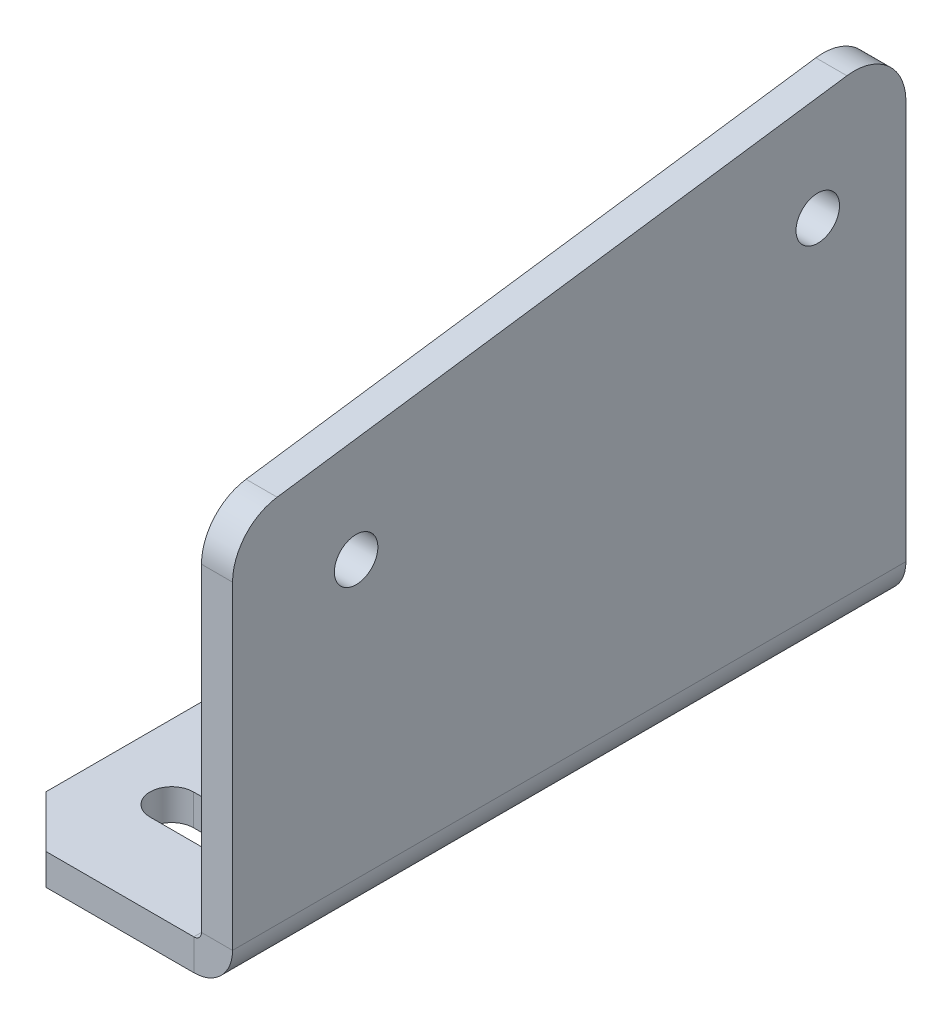
ISO-10303-21;
HEADER;
FILE_DESCRIPTION(('STEP AP214'),'2;1');
FILE_NAME('part.step','',(''),(''),'','','');
FILE_SCHEMA(('AUTOMOTIVE_DESIGN { 1 0 10303 214 1 1 1 1 }'));
ENDSEC;
DATA;
#1=APPLICATION_CONTEXT('core data for automotive mechanical design processes');
#2=APPLICATION_PROTOCOL_DEFINITION('international standard','automotive_design',2000,#1);
#3=PRODUCT_CONTEXT('',#1,'mechanical');
#4=PRODUCT('Part','Part','',(#3));
#5=PRODUCT_RELATED_PRODUCT_CATEGORY('part','',(#4));
#6=PRODUCT_DEFINITION_FORMATION('','',#4);
#7=PRODUCT_DEFINITION_CONTEXT('part definition',#1,'design');
#8=PRODUCT_DEFINITION('design','',#6,#7);
#9=PRODUCT_DEFINITION_SHAPE('','',#8);
#10=(LENGTH_UNIT() NAMED_UNIT(*) SI_UNIT(.MILLI.,.METRE.));
#11=(NAMED_UNIT(*) PLANE_ANGLE_UNIT() SI_UNIT($,.RADIAN.));
#12=(NAMED_UNIT(*) SI_UNIT($,.STERADIAN.) SOLID_ANGLE_UNIT());
#13=UNCERTAINTY_MEASURE_WITH_UNIT(LENGTH_MEASURE(1.E-05),#10,'distance_accuracy_value','');
#14=(GEOMETRIC_REPRESENTATION_CONTEXT(3) GLOBAL_UNCERTAINTY_ASSIGNED_CONTEXT((#13)) GLOBAL_UNIT_ASSIGNED_CONTEXT((#10,
#11,#12)) REPRESENTATION_CONTEXT('',''));
#15=CARTESIAN_POINT('',(0.,0.,0.));
#16=DIRECTION('',(0.,0.,1.));
#17=DIRECTION('',(1.,0.,0.));
#18=AXIS2_PLACEMENT_3D('',#15,#16,#17);
#19=CARTESIAN_POINT('',(0.,0.736599999999999,65.));
#20=DIRECTION('',(0.,0.,1.));
#21=DIRECTION('',(1.,0.,0.));
#22=AXIS2_PLACEMENT_3D('',#19,#20,#21);
#23=PLANE('',#22);
#24=DIRECTION('',(1.,0.,0.));
#25=VECTOR('',#24,1.);
#26=CARTESIAN_POINT('',(0.,0.736599999999999,65.));
#27=LINE('',#26,#25);
#28=CARTESIAN_POINT('',(0.,0.736599999999999,65.));
#29=VERTEX_POINT('',#28);
#30=CARTESIAN_POINT('',(3.,0.736599999999999,65.));
#31=VERTEX_POINT('',#30);
#32=EDGE_CURVE('E317',#29,#31,#27,.T.);
#33=ORIENTED_EDGE('',*,*,#32,.F.);
#34=CARTESIAN_POINT('',(-0.7366,0.7366,65.));
#35=DIRECTION('',(0.,0.,-1.));
#36=DIRECTION('',(-1.,0.,0.));
#37=AXIS2_PLACEMENT_3D('',#34,#35,#36);
#38=CIRCLE('',#37,0.7366);
#39=CARTESIAN_POINT('',(-0.7366,0.,65.));
#40=VERTEX_POINT('',#39);
#41=EDGE_CURVE('E267',#40,#29,#38,.F.);
#42=ORIENTED_EDGE('',*,*,#41,.F.);
#43=DIRECTION('',(0.,1.,0.));
#44=VECTOR('',#43,1.);
#45=CARTESIAN_POINT('',(-0.736600000000001,-3.,65.));
#46=LINE('',#45,#44);
#47=CARTESIAN_POINT('',(-0.736600000000001,-3.,65.));
#48=VERTEX_POINT('',#47);
#49=EDGE_CURVE('E314',#48,#40,#46,.T.);
#50=ORIENTED_EDGE('',*,*,#49,.F.);
#51=CARTESIAN_POINT('',(-0.7366,0.7366,65.));
#52=DIRECTION('',(0.,0.,1.));
#53=DIRECTION('',(1.,0.,0.));
#54=AXIS2_PLACEMENT_3D('',#51,#52,#53);
#55=CIRCLE('',#54,3.7366);
#56=EDGE_CURVE('E274',#48,#31,#55,.T.);
#57=ORIENTED_EDGE('',*,*,#56,.T.);
#58=EDGE_LOOP('',(#33,#42,#50,#57));
#59=FACE_BOUND('',#58,.T.);
#60=ADVANCED_FACE('F41',(#59),#23,.T.);
#61=CARTESIAN_POINT('',(-0.736600000000001,-3.,65.));
#62=DIRECTION('',(0.,0.,1.));
#63=DIRECTION('',(1.,0.,0.));
#64=AXIS2_PLACEMENT_3D('',#61,#62,#63);
#65=PLANE('',#64);
#66=DIRECTION('',(0.,1.,0.));
#67=VECTOR('',#66,1.);
#68=CARTESIAN_POINT('',(3.,0.,65.));
#69=LINE('',#68,#67);
#70=CARTESIAN_POINT('',(3.,31.5184120552639,65.));
#71=VERTEX_POINT('',#70);
#72=EDGE_CURVE('E260',#31,#71,#69,.T.);
#73=ORIENTED_EDGE('',*,*,#72,.T.);
#74=DIRECTION('',(-1.,0.,0.));
#75=VECTOR('',#74,1.);
#76=CARTESIAN_POINT('',(0.,31.5184120552639,65.));
#77=LINE('',#76,#75);
#78=CARTESIAN_POINT('',(0.,31.5184120552638,65.));
#79=VERTEX_POINT('',#78);
#80=EDGE_CURVE('E337',#71,#79,#77,.T.);
#81=ORIENTED_EDGE('',*,*,#80,.T.);
#82=DIRECTION('',(0.,1.,0.));
#83=VECTOR('',#82,1.);
#84=CARTESIAN_POINT('',(0.,0.,65.));
#85=LINE('',#84,#83);
#86=EDGE_CURVE('E263',#29,#79,#85,.T.);
#87=ORIENTED_EDGE('',*,*,#86,.F.);
#88=ORIENTED_EDGE('',*,*,#32,.T.);
#89=EDGE_LOOP('',(#73,#81,#87,#88));
#90=FACE_BOUND('',#89,.T.);
#91=ADVANCED_FACE('F354',(#90),#65,.T.);
#92=CARTESIAN_POINT('',(-0.7366,0.,0.));
#93=DIRECTION('',(0.,0.,-1.));
#94=DIRECTION('',(-1.,0.,0.));
#95=AXIS2_PLACEMENT_3D('',#92,#93,#94);
#96=PLANE('',#95);
#97=DIRECTION('',(0.,-1.,0.));
#98=VECTOR('',#97,1.);
#99=CARTESIAN_POINT('',(-0.7366,0.,0.));
#100=LINE('',#99,#98);
#101=CARTESIAN_POINT('',(-0.7366,0.,0.));
#102=VERTEX_POINT('',#101);
#103=CARTESIAN_POINT('',(-0.736600000000001,-3.,0.));
#104=VERTEX_POINT('',#103);
#105=EDGE_CURVE('E311',#102,#104,#100,.T.);
#106=ORIENTED_EDGE('',*,*,#105,.F.);
#107=CARTESIAN_POINT('',(-0.7366,0.7366,0.));
#108=DIRECTION('',(0.,0.,-1.));
#109=DIRECTION('',(-1.,0.,0.));
#110=AXIS2_PLACEMENT_3D('',#107,#108,#109);
#111=CIRCLE('',#110,0.7366);
#112=CARTESIAN_POINT('',(0.,0.736599999999999,0.));
#113=VERTEX_POINT('',#112);
#114=EDGE_CURVE('E283',#102,#113,#111,.F.);
#115=ORIENTED_EDGE('',*,*,#114,.T.);
#116=DIRECTION('',(-1.,0.,0.));
#117=VECTOR('',#116,1.);
#118=CARTESIAN_POINT('',(3.,0.736599999999999,0.));
#119=LINE('',#118,#117);
#120=CARTESIAN_POINT('',(3.,0.736599999999999,0.));
#121=VERTEX_POINT('',#120);
#122=EDGE_CURVE('E309',#121,#113,#119,.T.);
#123=ORIENTED_EDGE('',*,*,#122,.F.);
#124=CARTESIAN_POINT('',(-0.7366,0.7366,0.));
#125=DIRECTION('',(0.,0.,1.));
#126=DIRECTION('',(1.,0.,0.));
#127=AXIS2_PLACEMENT_3D('',#124,#125,#126);
#128=CIRCLE('',#127,3.7366);
#129=EDGE_CURVE('E264',#104,#121,#128,.T.);
#130=ORIENTED_EDGE('',*,*,#129,.F.);
#131=EDGE_LOOP('',(#106,#115,#123,#130));
#132=FACE_BOUND('',#131,.T.);
#133=ADVANCED_FACE('F407',(#132),#96,.T.);
#134=CARTESIAN_POINT('',(3.,0.736599999999999,0.));
#135=DIRECTION('',(0.,0.,-1.));
#136=DIRECTION('',(-1.,0.,0.));
#137=AXIS2_PLACEMENT_3D('',#134,#135,#136);
#138=PLANE('',#137);
#139=DIRECTION('',(1.,0.,0.));
#140=VECTOR('',#139,1.);
#141=CARTESIAN_POINT('',(0.,-3.,0.));
#142=LINE('',#141,#140);
#143=CARTESIAN_POINT('',(-15.,-3.,0.));
#144=VERTEX_POINT('',#143);
#145=EDGE_CURVE('E288',#144,#104,#142,.T.);
#146=ORIENTED_EDGE('',*,*,#145,.F.);
#147=DIRECTION('',(0.,1.,0.));
#148=VECTOR('',#147,1.);
#149=CARTESIAN_POINT('',(-15.,0.736599999999999,0.));
#150=LINE('',#149,#148);
#151=CARTESIAN_POINT('',(-15.,0.,0.));
#152=VERTEX_POINT('',#151);
#153=EDGE_CURVE('E319',#144,#152,#150,.T.);
#154=ORIENTED_EDGE('',*,*,#153,.T.);
#155=DIRECTION('',(1.,0.,0.));
#156=VECTOR('',#155,1.);
#157=CARTESIAN_POINT('',(0.,0.,0.));
#158=LINE('',#157,#156);
#159=EDGE_CURVE('E286',#152,#102,#158,.T.);
#160=ORIENTED_EDGE('',*,*,#159,.T.);
#161=ORIENTED_EDGE('',*,*,#105,.T.);
#162=EDGE_LOOP('',(#146,#154,#160,#161));
#163=FACE_BOUND('',#162,.T.);
#164=ADVANCED_FACE('F466',(#163),#138,.T.);
#165=CARTESIAN_POINT('',(3.,0.,65.));
#166=DIRECTION('',(-1.,0.,0.));
#167=DIRECTION('',(0.,0.,1.));
#168=AXIS2_PLACEMENT_3D('',#165,#166,#167);
#169=PLANE('',#168);
#170=CARTESIAN_POINT('',(3.,27.4427987597811,53.0730127711858));
#171=DIRECTION('',(-1.,0.,0.));
#172=DIRECTION('',(0.,0.,1.));
#173=AXIS2_PLACEMENT_3D('',#170,#171,#172);
#174=CIRCLE('',#173,2.1);
#175=CARTESIAN_POINT('',(3.,27.4427987597811,55.1730127711858));
#176=VERTEX_POINT('',#175);
#177=EDGE_CURVE('E370',#176,#176,#174,.T.);
#178=ORIENTED_EDGE('',*,*,#177,.T.);
#179=EDGE_LOOP('',(#178));
#180=FACE_BOUND('',#179,.T.);
#181=CARTESIAN_POINT('',(3.,33.7055883029837,8.51094967781513));
#182=DIRECTION('',(-1.,0.,0.));
#183=DIRECTION('',(0.,0.,1.));
#184=AXIS2_PLACEMENT_3D('',#181,#182,#183);
#185=CIRCLE('',#184,2.1);
#186=CARTESIAN_POINT('',(3.,33.7055883029837,10.6109496778151));
#187=VERTEX_POINT('',#186);
#188=EDGE_CURVE('E363',#187,#187,#185,.T.);
#189=ORIENTED_EDGE('',*,*,#188,.T.);
#190=EDGE_LOOP('',(#189));
#191=FACE_BOUND('',#190,.T.);
#192=DIRECTION('',(0.,-0.139173100960058,0.990268068741571));
#193=VECTOR('',#192,1.);
#194=CARTESIAN_POINT('',(3.,35.864845744345,65.));
#195=LINE('',#194,#193);
#196=CARTESIAN_POINT('',(3.,44.1994983076028,5.69586550480031));
#197=VERTEX_POINT('',#196);
#198=CARTESIAN_POINT('',(3.,36.4697523989717,60.6958655048003));
#199=VERTEX_POINT('',#198);
#200=EDGE_CURVE('E218',#197,#199,#195,.T.);
#201=ORIENTED_EDGE('',*,*,#200,.T.);
#202=CARTESIAN_POINT('',(3.,31.5184120552639,60.));
#203=DIRECTION('',(-1.,0.,0.));
#204=DIRECTION('',(0.,0.,1.));
#205=AXIS2_PLACEMENT_3D('',#202,#203,#204);
#206=CIRCLE('',#205,5.);
#207=EDGE_CURVE('E49',#199,#71,#206,.F.);
#208=ORIENTED_EDGE('',*,*,#207,.T.);
#209=ORIENTED_EDGE('',*,*,#72,.F.);
#210=DIRECTION('',(0.,0.,-1.));
#211=VECTOR('',#210,1.);
#212=CARTESIAN_POINT('',(3.,0.736599999999999,65.));
#213=LINE('',#212,#211);
#214=EDGE_CURVE('E277',#31,#121,#213,.T.);
#215=ORIENTED_EDGE('',*,*,#214,.T.);
#216=DIRECTION('',(0.,1.,0.));
#217=VECTOR('',#216,1.);
#218=CARTESIAN_POINT('',(3.,0.,0.));
#219=LINE('',#218,#217);
#220=CARTESIAN_POINT('',(3.,39.248157963895,0.));
#221=VERTEX_POINT('',#220);
#222=EDGE_CURVE('E253',#121,#221,#219,.T.);
#223=ORIENTED_EDGE('',*,*,#222,.T.);
#224=CARTESIAN_POINT('',(3.,39.248157963895,5.));
#225=DIRECTION('',(-1.,0.,0.));
#226=DIRECTION('',(0.,0.,1.));
#227=AXIS2_PLACEMENT_3D('',#224,#225,#226);
#228=CIRCLE('',#227,5.);
#229=EDGE_CURVE('E56',#221,#197,#228,.F.);
#230=ORIENTED_EDGE('',*,*,#229,.T.);
#231=EDGE_LOOP('',(#201,#208,#209,#215,#223,#230));
#232=FACE_BOUND('',#231,.T.);
#233=ADVANCED_FACE('F350',(#180,#191,#232),#169,.F.);
#234=CARTESIAN_POINT('',(0.,0.,65.));
#235=DIRECTION('',(-1.,0.,0.));
#236=DIRECTION('',(0.,0.,1.));
#237=AXIS2_PLACEMENT_3D('',#234,#235,#236);
#238=PLANE('',#237);
#239=CARTESIAN_POINT('',(0.,27.4427987597811,53.0730127711858));
#240=DIRECTION('',(-1.,0.,0.));
#241=DIRECTION('',(0.,0.,1.));
#242=AXIS2_PLACEMENT_3D('',#239,#240,#241);
#243=CIRCLE('',#242,2.1);
#244=CARTESIAN_POINT('',(0.,27.4427987597811,55.1730127711858));
#245=VERTEX_POINT('',#244);
#246=EDGE_CURVE('E373',#245,#245,#243,.T.);
#247=ORIENTED_EDGE('',*,*,#246,.F.);
#248=EDGE_LOOP('',(#247));
#249=FACE_BOUND('',#248,.T.);
#250=CARTESIAN_POINT('',(0.,33.7055883029837,8.51094967781513));
#251=DIRECTION('',(-1.,0.,0.));
#252=DIRECTION('',(0.,0.,1.));
#253=AXIS2_PLACEMENT_3D('',#250,#251,#252);
#254=CIRCLE('',#253,2.1);
#255=CARTESIAN_POINT('',(0.,33.7055883029837,10.6109496778151));
#256=VERTEX_POINT('',#255);
#257=EDGE_CURVE('E365',#256,#256,#254,.T.);
#258=ORIENTED_EDGE('',*,*,#257,.F.);
#259=EDGE_LOOP('',(#258));
#260=FACE_BOUND('',#259,.T.);
#261=ORIENTED_EDGE('',*,*,#86,.T.);
#262=CARTESIAN_POINT('',(0.,31.5184120552639,60.));
#263=DIRECTION('',(-1.,0.,0.));
#264=DIRECTION('',(0.,0.,1.));
#265=AXIS2_PLACEMENT_3D('',#262,#263,#264);
#266=CIRCLE('',#265,5.);
#267=CARTESIAN_POINT('',(0.,36.4697523989717,60.6958655048003));
#268=VERTEX_POINT('',#267);
#269=EDGE_CURVE('E342',#79,#268,#266,.T.);
#270=ORIENTED_EDGE('',*,*,#269,.T.);
#271=DIRECTION('',(0.,-0.139173100960058,0.990268068741571));
#272=VECTOR('',#271,1.);
#273=CARTESIAN_POINT('',(0.,35.864845744345,65.));
#274=LINE('',#273,#272);
#275=CARTESIAN_POINT('',(0.,44.1994983076028,5.69586550480031));
#276=VERTEX_POINT('',#275);
#277=EDGE_CURVE('E211',#276,#268,#274,.T.);
#278=ORIENTED_EDGE('',*,*,#277,.F.);
#279=CARTESIAN_POINT('',(0.,39.248157963895,5.));
#280=DIRECTION('',(-1.,0.,0.));
#281=DIRECTION('',(0.,0.,1.));
#282=AXIS2_PLACEMENT_3D('',#279,#280,#281);
#283=CIRCLE('',#282,5.);
#284=CARTESIAN_POINT('',(0.,39.248157963895,0.));
#285=VERTEX_POINT('',#284);
#286=EDGE_CURVE('E340',#276,#285,#283,.T.);
#287=ORIENTED_EDGE('',*,*,#286,.T.);
#288=DIRECTION('',(0.,1.,0.));
#289=VECTOR('',#288,1.);
#290=CARTESIAN_POINT('',(0.,0.,0.));
#291=LINE('',#290,#289);
#292=EDGE_CURVE('E280',#113,#285,#291,.T.);
#293=ORIENTED_EDGE('',*,*,#292,.F.);
#294=DIRECTION('',(0.,0.,-1.));
#295=VECTOR('',#294,1.);
#296=CARTESIAN_POINT('',(0.,0.736599999999999,65.));
#297=LINE('',#296,#295);
#298=EDGE_CURVE('E306',#29,#113,#297,.T.);
#299=ORIENTED_EDGE('',*,*,#298,.F.);
#300=EDGE_LOOP('',(#261,#270,#278,#287,#293,#299));
#301=FACE_BOUND('',#300,.T.);
#302=ADVANCED_FACE('F359',(#249,#260,#301),#238,.T.);
#303=CARTESIAN_POINT('',(-0.7366,0.7366,65.));
#304=DIRECTION('',(0.,0.,-1.));
#305=DIRECTION('',(-1.,0.,0.));
#306=AXIS2_PLACEMENT_3D('',#303,#304,#305);
#307=CYLINDRICAL_SURFACE('',#306,0.7366);
#308=ORIENTED_EDGE('',*,*,#114,.F.);
#309=DIRECTION('',(0.,0.,-1.));
#310=VECTOR('',#309,1.);
#311=CARTESIAN_POINT('',(-0.7366,0.,65.));
#312=LINE('',#311,#310);
#313=EDGE_CURVE('E303',#40,#102,#312,.T.);
#314=ORIENTED_EDGE('',*,*,#313,.F.);
#315=ORIENTED_EDGE('',*,*,#41,.T.);
#316=ORIENTED_EDGE('',*,*,#298,.T.);
#317=EDGE_LOOP('',(#308,#314,#315,#316));
#318=FACE_BOUND('',#317,.T.);
#319=ADVANCED_FACE('F389',(#318),#307,.F.);
#320=CARTESIAN_POINT('',(0.,0.,65.));
#321=DIRECTION('',(0.,1.,0.));
#322=DIRECTION('',(-1.,0.,0.));
#323=AXIS2_PLACEMENT_3D('',#320,#321,#322);
#324=PLANE('',#323);
#325=CARTESIAN_POINT('',(-7.8683,0.,10.));
#326=DIRECTION('',(0.,1.,0.));
#327=DIRECTION('',(0.,0.,1.));
#328=AXIS2_PLACEMENT_3D('',#325,#326,#327);
#329=CIRCLE('',#328,2.1);
#330=CARTESIAN_POINT('',(-7.8683,0.,12.1));
#331=VERTEX_POINT('',#330);
#332=CARTESIAN_POINT('',(-7.8683,0.,7.9));
#333=VERTEX_POINT('',#332);
#334=EDGE_CURVE('E187',#331,#333,#329,.T.);
#335=ORIENTED_EDGE('',*,*,#334,.F.);
#336=DIRECTION('',(1.,0.,0.));
#337=VECTOR('',#336,1.);
#338=CARTESIAN_POINT('',(-7.8683,0.,12.1));
#339=LINE('',#338,#337);
#340=CARTESIAN_POINT('',(-12.8683,0.,12.1));
#341=VERTEX_POINT('',#340);
#342=EDGE_CURVE('E205',#341,#331,#339,.T.);
#343=ORIENTED_EDGE('',*,*,#342,.F.);
#344=CARTESIAN_POINT('',(-12.8683,0.,10.));
#345=DIRECTION('',(0.,1.,0.));
#346=DIRECTION('',(0.,0.,1.));
#347=AXIS2_PLACEMENT_3D('',#344,#345,#346);
#348=CIRCLE('',#347,2.1);
#349=CARTESIAN_POINT('',(-12.8683,0.,7.9));
#350=VERTEX_POINT('',#349);
#351=EDGE_CURVE('E208',#350,#341,#348,.T.);
#352=ORIENTED_EDGE('',*,*,#351,.F.);
#353=DIRECTION('',(-1.,0.,0.));
#354=VECTOR('',#353,1.);
#355=CARTESIAN_POINT('',(-7.8683,0.,7.9));
#356=LINE('',#355,#354);
#357=EDGE_CURVE('E217',#333,#350,#356,.T.);
#358=ORIENTED_EDGE('',*,*,#357,.F.);
#359=EDGE_LOOP('',(#335,#343,#352,#358));
#360=FACE_BOUND('',#359,.T.);
#361=CARTESIAN_POINT('',(-7.8683,0.,55.));
#362=DIRECTION('',(0.,1.,0.));
#363=DIRECTION('',(0.,0.,1.));
#364=AXIS2_PLACEMENT_3D('',#361,#362,#363);
#365=CIRCLE('',#364,2.1);
#366=CARTESIAN_POINT('',(-7.8683,0.,57.1));
#367=VERTEX_POINT('',#366);
#368=CARTESIAN_POINT('',(-7.8683,0.,52.9));
#369=VERTEX_POINT('',#368);
#370=EDGE_CURVE('E224',#367,#369,#365,.T.);
#371=ORIENTED_EDGE('',*,*,#370,.F.);
#372=DIRECTION('',(1.,0.,0.));
#373=VECTOR('',#372,1.);
#374=CARTESIAN_POINT('',(-7.8683,0.,57.1));
#375=LINE('',#374,#373);
#376=CARTESIAN_POINT('',(-12.8683,0.,57.1));
#377=VERTEX_POINT('',#376);
#378=EDGE_CURVE('E232',#377,#367,#375,.T.);
#379=ORIENTED_EDGE('',*,*,#378,.F.);
#380=CARTESIAN_POINT('',(-12.8683,0.,55.));
#381=DIRECTION('',(0.,1.,0.));
#382=DIRECTION('',(0.,0.,1.));
#383=AXIS2_PLACEMENT_3D('',#380,#381,#382);
#384=CIRCLE('',#383,2.1);
#385=CARTESIAN_POINT('',(-12.8683,0.,52.9));
#386=VERTEX_POINT('',#385);
#387=EDGE_CURVE('E246',#386,#377,#384,.T.);
#388=ORIENTED_EDGE('',*,*,#387,.F.);
#389=DIRECTION('',(-1.,0.,0.));
#390=VECTOR('',#389,1.);
#391=CARTESIAN_POINT('',(-7.8683,0.,52.9));
#392=LINE('',#391,#390);
#393=EDGE_CURVE('E243',#369,#386,#392,.T.);
#394=ORIENTED_EDGE('',*,*,#393,.F.);
#395=EDGE_LOOP('',(#371,#379,#388,#394));
#396=FACE_BOUND('',#395,.T.);
#397=ORIENTED_EDGE('',*,*,#159,.F.);
#398=DIRECTION('',(0.707106781186546,0.,-0.707106781186549));
#399=VECTOR('',#398,1.);
#400=CARTESIAN_POINT('',(-40.,0.,25.0000000000001));
#401=LINE('',#400,#399);
#402=CARTESIAN_POINT('',(-20.,0.,5.00000000000002));
#403=VERTEX_POINT('',#402);
#404=EDGE_CURVE('E324',#152,#403,#401,.F.);
#405=ORIENTED_EDGE('',*,*,#404,.T.);
#406=DIRECTION('',(0.,0.,-1.));
#407=VECTOR('',#406,1.);
#408=CARTESIAN_POINT('',(-20.,0.,65.));
#409=LINE('',#408,#407);
#410=CARTESIAN_POINT('',(-20.,0.,60.));
#411=VERTEX_POINT('',#410);
#412=EDGE_CURVE('E300',#411,#403,#409,.T.);
#413=ORIENTED_EDGE('',*,*,#412,.F.);
#414=DIRECTION('',(0.707106781186548,0.,0.707106781186547));
#415=VECTOR('',#414,1.);
#416=CARTESIAN_POINT('',(-7.49999999999998,0.,72.5));
#417=LINE('',#416,#415);
#418=CARTESIAN_POINT('',(-15.,0.,65.));
#419=VERTEX_POINT('',#418);
#420=EDGE_CURVE('E322',#411,#419,#417,.T.);
#421=ORIENTED_EDGE('',*,*,#420,.T.);
#422=DIRECTION('',(1.,0.,0.));
#423=VECTOR('',#422,1.);
#424=CARTESIAN_POINT('',(0.,0.,65.));
#425=LINE('',#424,#423);
#426=EDGE_CURVE('E270',#419,#40,#425,.T.);
#427=ORIENTED_EDGE('',*,*,#426,.T.);
#428=ORIENTED_EDGE('',*,*,#313,.T.);
#429=EDGE_LOOP('',(#397,#405,#413,#421,#427,#428));
#430=FACE_BOUND('',#429,.T.);
#431=ADVANCED_FACE('F450',(#360,#396,#430),#324,.T.);
#432=CARTESIAN_POINT('',(-20.,-3.,65.));
#433=DIRECTION('',(-1.,0.,0.));
#434=DIRECTION('',(0.,0.,1.));
#435=AXIS2_PLACEMENT_3D('',#432,#433,#434);
#436=PLANE('',#435);
#437=ORIENTED_EDGE('',*,*,#412,.T.);
#438=DIRECTION('',(0.,-1.,0.));
#439=VECTOR('',#438,1.);
#440=CARTESIAN_POINT('',(-20.,-3.,5.00000000000002));
#441=LINE('',#440,#439);
#442=CARTESIAN_POINT('',(-20.,-3.,5.00000000000002));
#443=VERTEX_POINT('',#442);
#444=EDGE_CURVE('E329',#403,#443,#441,.T.);
#445=ORIENTED_EDGE('',*,*,#444,.T.);
#446=DIRECTION('',(0.,0.,-1.));
#447=VECTOR('',#446,1.);
#448=CARTESIAN_POINT('',(-20.,-3.,65.));
#449=LINE('',#448,#447);
#450=CARTESIAN_POINT('',(-20.,-3.,60.));
#451=VERTEX_POINT('',#450);
#452=EDGE_CURVE('E297',#451,#443,#449,.T.);
#453=ORIENTED_EDGE('',*,*,#452,.F.);
#454=DIRECTION('',(0.,1.,0.));
#455=VECTOR('',#454,1.);
#456=CARTESIAN_POINT('',(-20.,0.,60.));
#457=LINE('',#456,#455);
#458=EDGE_CURVE('E326',#451,#411,#457,.T.);
#459=ORIENTED_EDGE('',*,*,#458,.T.);
#460=EDGE_LOOP('',(#437,#445,#453,#459));
#461=FACE_BOUND('',#460,.T.);
#462=ADVANCED_FACE('F462',(#461),#436,.T.);
#463=CARTESIAN_POINT('',(0.,-3.,65.));
#464=DIRECTION('',(0.,1.,0.));
#465=DIRECTION('',(-1.,0.,0.));
#466=AXIS2_PLACEMENT_3D('',#463,#464,#465);
#467=PLANE('',#466);
#468=DIRECTION('',(1.,0.,0.));
#469=VECTOR('',#468,1.);
#470=CARTESIAN_POINT('',(-7.8683,-3.,12.1));
#471=LINE('',#470,#469);
#472=CARTESIAN_POINT('',(-12.8683,-3.,12.1));
#473=VERTEX_POINT('',#472);
#474=CARTESIAN_POINT('',(-7.8683,-3.,12.1));
#475=VERTEX_POINT('',#474);
#476=EDGE_CURVE('E192',#473,#475,#471,.T.);
#477=ORIENTED_EDGE('',*,*,#476,.T.);
#478=CARTESIAN_POINT('',(-7.8683,-3.,10.));
#479=DIRECTION('',(0.,1.,0.));
#480=DIRECTION('',(0.,0.,1.));
#481=AXIS2_PLACEMENT_3D('',#478,#479,#480);
#482=CIRCLE('',#481,2.1);
#483=CARTESIAN_POINT('',(-7.8683,-3.,7.9));
#484=VERTEX_POINT('',#483);
#485=EDGE_CURVE('E184',#475,#484,#482,.T.);
#486=ORIENTED_EDGE('',*,*,#485,.T.);
#487=DIRECTION('',(-1.,0.,0.));
#488=VECTOR('',#487,1.);
#489=CARTESIAN_POINT('',(-7.8683,-3.,7.9));
#490=LINE('',#489,#488);
#491=CARTESIAN_POINT('',(-12.8683,-3.,7.9));
#492=VERTEX_POINT('',#491);
#493=EDGE_CURVE('E196',#484,#492,#490,.T.);
#494=ORIENTED_EDGE('',*,*,#493,.T.);
#495=CARTESIAN_POINT('',(-12.8683,-3.,10.));
#496=DIRECTION('',(0.,1.,0.));
#497=DIRECTION('',(0.,0.,1.));
#498=AXIS2_PLACEMENT_3D('',#495,#496,#497);
#499=CIRCLE('',#498,2.1);
#500=EDGE_CURVE('E200',#492,#473,#499,.T.);
#501=ORIENTED_EDGE('',*,*,#500,.T.);
#502=EDGE_LOOP('',(#477,#486,#494,#501));
#503=FACE_BOUND('',#502,.T.);
#504=DIRECTION('',(1.,0.,0.));
#505=VECTOR('',#504,1.);
#506=CARTESIAN_POINT('',(-7.8683,-3.,57.1));
#507=LINE('',#506,#505);
#508=CARTESIAN_POINT('',(-12.8683,-3.,57.1));
#509=VERTEX_POINT('',#508);
#510=CARTESIAN_POINT('',(-7.8683,-3.,57.1));
#511=VERTEX_POINT('',#510);
#512=EDGE_CURVE('E238',#509,#511,#507,.T.);
#513=ORIENTED_EDGE('',*,*,#512,.T.);
#514=CARTESIAN_POINT('',(-7.8683,-3.,55.));
#515=DIRECTION('',(0.,1.,0.));
#516=DIRECTION('',(0.,0.,1.));
#517=AXIS2_PLACEMENT_3D('',#514,#515,#516);
#518=CIRCLE('',#517,2.1);
#519=CARTESIAN_POINT('',(-7.8683,-3.,52.9));
#520=VERTEX_POINT('',#519);
#521=EDGE_CURVE('E228',#511,#520,#518,.T.);
#522=ORIENTED_EDGE('',*,*,#521,.T.);
#523=DIRECTION('',(-1.,0.,0.));
#524=VECTOR('',#523,1.);
#525=CARTESIAN_POINT('',(-7.8683,-3.,52.9));
#526=LINE('',#525,#524);
#527=CARTESIAN_POINT('',(-12.8683,-3.,52.9));
#528=VERTEX_POINT('',#527);
#529=EDGE_CURVE('E231',#520,#528,#526,.T.);
#530=ORIENTED_EDGE('',*,*,#529,.T.);
#531=CARTESIAN_POINT('',(-12.8683,-3.,55.));
#532=DIRECTION('',(0.,1.,0.));
#533=DIRECTION('',(0.,0.,1.));
#534=AXIS2_PLACEMENT_3D('',#531,#532,#533);
#535=CIRCLE('',#534,2.1);
#536=EDGE_CURVE('E235',#528,#509,#535,.T.);
#537=ORIENTED_EDGE('',*,*,#536,.T.);
#538=EDGE_LOOP('',(#513,#522,#530,#537));
#539=FACE_BOUND('',#538,.T.);
#540=ORIENTED_EDGE('',*,*,#452,.T.);
#541=DIRECTION('',(-0.707106781186546,0.,0.707106781186549));
#542=VECTOR('',#541,1.);
#543=CARTESIAN_POINT('',(-15.,-3.,0.));
#544=LINE('',#543,#542);
#545=EDGE_CURVE('E333',#443,#144,#544,.F.);
#546=ORIENTED_EDGE('',*,*,#545,.T.);
#547=ORIENTED_EDGE('',*,*,#145,.T.);
#548=DIRECTION('',(0.,0.,-1.));
#549=VECTOR('',#548,1.);
#550=CARTESIAN_POINT('',(-0.736600000000001,-3.,65.));
#551=LINE('',#550,#549);
#552=EDGE_CURVE('E294',#48,#104,#551,.T.);
#553=ORIENTED_EDGE('',*,*,#552,.F.);
#554=DIRECTION('',(1.,0.,0.));
#555=VECTOR('',#554,1.);
#556=CARTESIAN_POINT('',(0.,-3.,65.));
#557=LINE('',#556,#555);
#558=CARTESIAN_POINT('',(-15.,-3.,65.));
#559=VERTEX_POINT('',#558);
#560=EDGE_CURVE('E272',#559,#48,#557,.T.);
#561=ORIENTED_EDGE('',*,*,#560,.F.);
#562=DIRECTION('',(-0.707106781186548,0.,-0.707106781186547));
#563=VECTOR('',#562,1.);
#564=CARTESIAN_POINT('',(-20.,-3.,60.));
#565=LINE('',#564,#563);
#566=EDGE_CURVE('E331',#559,#451,#565,.T.);
#567=ORIENTED_EDGE('',*,*,#566,.T.);
#568=EDGE_LOOP('',(#540,#546,#547,#553,#561,#567));
#569=FACE_BOUND('',#568,.T.);
#570=ADVANCED_FACE('F202',(#503,#539,#569),#467,.F.);
#571=CARTESIAN_POINT('',(-0.7366,0.7366,65.));
#572=DIRECTION('',(0.,0.,-1.));
#573=DIRECTION('',(-1.,0.,0.));
#574=AXIS2_PLACEMENT_3D('',#571,#572,#573);
#575=CYLINDRICAL_SURFACE('',#574,3.7366);
#576=ORIENTED_EDGE('',*,*,#129,.T.);
#577=ORIENTED_EDGE('',*,*,#214,.F.);
#578=ORIENTED_EDGE('',*,*,#56,.F.);
#579=ORIENTED_EDGE('',*,*,#552,.T.);
#580=EDGE_LOOP('',(#576,#577,#578,#579));
#581=FACE_BOUND('',#580,.T.);
#582=ADVANCED_FACE('F444',(#581),#575,.T.);
#583=CARTESIAN_POINT('',(-0.7366,0.7366,65.));
#584=DIRECTION('',(0.,0.,-1.));
#585=DIRECTION('',(-1.,0.,0.));
#586=AXIS2_PLACEMENT_3D('',#583,#584,#585);
#587=PLANE('',#586);
#588=ORIENTED_EDGE('',*,*,#426,.F.);
#589=DIRECTION('',(0.,-1.,0.));
#590=VECTOR('',#589,1.);
#591=CARTESIAN_POINT('',(-15.,-3.,65.));
#592=LINE('',#591,#590);
#593=EDGE_CURVE('E335',#419,#559,#592,.T.);
#594=ORIENTED_EDGE('',*,*,#593,.T.);
#595=ORIENTED_EDGE('',*,*,#560,.T.);
#596=ORIENTED_EDGE('',*,*,#49,.T.);
#597=EDGE_LOOP('',(#588,#594,#595,#596));
#598=FACE_BOUND('',#597,.T.);
#599=ADVANCED_FACE('F455',(#598),#587,.F.);
#600=CARTESIAN_POINT('',(-0.7366,0.7366,0.));
#601=DIRECTION('',(0.,0.,-1.));
#602=DIRECTION('',(-1.,0.,0.));
#603=AXIS2_PLACEMENT_3D('',#600,#601,#602);
#604=PLANE('',#603);
#605=ORIENTED_EDGE('',*,*,#292,.T.);
#606=DIRECTION('',(1.,0.,0.));
#607=VECTOR('',#606,1.);
#608=CARTESIAN_POINT('',(3.,39.248157963895,0.));
#609=LINE('',#608,#607);
#610=EDGE_CURVE('E11',#285,#221,#609,.T.);
#611=ORIENTED_EDGE('',*,*,#610,.T.);
#612=ORIENTED_EDGE('',*,*,#222,.F.);
#613=ORIENTED_EDGE('',*,*,#122,.T.);
#614=EDGE_LOOP('',(#605,#611,#612,#613));
#615=FACE_BOUND('',#614,.T.);
#616=ADVANCED_FACE('F431',(#615),#604,.T.);
#617=CARTESIAN_POINT('',(-7.8683,-3.,55.));
#618=DIRECTION('',(0.,1.,0.));
#619=DIRECTION('',(0.,0.,1.));
#620=AXIS2_PLACEMENT_3D('',#617,#618,#619);
#621=CYLINDRICAL_SURFACE('',#620,2.1);
#622=ORIENTED_EDGE('',*,*,#370,.T.);
#623=DIRECTION('',(0.,1.,0.));
#624=VECTOR('',#623,1.);
#625=CARTESIAN_POINT('',(-7.8683,-3.,52.9));
#626=LINE('',#625,#624);
#627=EDGE_CURVE('E241',#520,#369,#626,.T.);
#628=ORIENTED_EDGE('',*,*,#627,.F.);
#629=ORIENTED_EDGE('',*,*,#521,.F.);
#630=DIRECTION('',(0.,1.,0.));
#631=VECTOR('',#630,1.);
#632=CARTESIAN_POINT('',(-7.8683,-3.,57.1));
#633=LINE('',#632,#631);
#634=EDGE_CURVE('E251',#511,#367,#633,.T.);
#635=ORIENTED_EDGE('',*,*,#634,.T.);
#636=EDGE_LOOP('',(#622,#628,#629,#635));
#637=FACE_BOUND('',#636,.T.);
#638=ADVANCED_FACE('F488',(#637),#621,.F.);
#639=CARTESIAN_POINT('',(-7.8683,-3.,57.1));
#640=DIRECTION('',(0.,0.,1.));
#641=DIRECTION('',(1.,0.,0.));
#642=AXIS2_PLACEMENT_3D('',#639,#640,#641);
#643=PLANE('',#642);
#644=ORIENTED_EDGE('',*,*,#378,.T.);
#645=ORIENTED_EDGE('',*,*,#634,.F.);
#646=ORIENTED_EDGE('',*,*,#512,.F.);
#647=DIRECTION('',(0.,1.,0.));
#648=VECTOR('',#647,1.);
#649=CARTESIAN_POINT('',(-12.8683,-3.,57.1));
#650=LINE('',#649,#648);
#651=EDGE_CURVE('E254',#509,#377,#650,.T.);
#652=ORIENTED_EDGE('',*,*,#651,.T.);
#653=EDGE_LOOP('',(#644,#645,#646,#652));
#654=FACE_BOUND('',#653,.T.);
#655=ADVANCED_FACE('F493',(#654),#643,.F.);
#656=CARTESIAN_POINT('',(-12.8683,-3.,55.));
#657=DIRECTION('',(0.,1.,0.));
#658=DIRECTION('',(0.,0.,1.));
#659=AXIS2_PLACEMENT_3D('',#656,#657,#658);
#660=CYLINDRICAL_SURFACE('',#659,2.1);
#661=ORIENTED_EDGE('',*,*,#387,.T.);
#662=ORIENTED_EDGE('',*,*,#651,.F.);
#663=ORIENTED_EDGE('',*,*,#536,.F.);
#664=DIRECTION('',(0.,1.,0.));
#665=VECTOR('',#664,1.);
#666=CARTESIAN_POINT('',(-12.8683,-3.,52.9));
#667=LINE('',#666,#665);
#668=EDGE_CURVE('E256',#528,#386,#667,.T.);
#669=ORIENTED_EDGE('',*,*,#668,.T.);
#670=EDGE_LOOP('',(#661,#662,#663,#669));
#671=FACE_BOUND('',#670,.T.);
#672=ADVANCED_FACE('F498',(#671),#660,.F.);
#673=CARTESIAN_POINT('',(-7.8683,-3.,52.9));
#674=DIRECTION('',(0.,0.,-1.));
#675=DIRECTION('',(-1.,0.,0.));
#676=AXIS2_PLACEMENT_3D('',#673,#674,#675);
#677=PLANE('',#676);
#678=ORIENTED_EDGE('',*,*,#393,.T.);
#679=ORIENTED_EDGE('',*,*,#668,.F.);
#680=ORIENTED_EDGE('',*,*,#529,.F.);
#681=ORIENTED_EDGE('',*,*,#627,.T.);
#682=EDGE_LOOP('',(#678,#679,#680,#681));
#683=FACE_BOUND('',#682,.T.);
#684=ADVANCED_FACE('F495',(#683),#677,.F.);
#685=CARTESIAN_POINT('',(-7.8683,-3.,10.));
#686=DIRECTION('',(0.,1.,0.));
#687=DIRECTION('',(0.,0.,1.));
#688=AXIS2_PLACEMENT_3D('',#685,#686,#687);
#689=CYLINDRICAL_SURFACE('',#688,2.1);
#690=ORIENTED_EDGE('',*,*,#334,.T.);
#691=DIRECTION('',(0.,1.,0.));
#692=VECTOR('',#691,1.);
#693=CARTESIAN_POINT('',(-7.8683,-3.,7.9));
#694=LINE('',#693,#692);
#695=EDGE_CURVE('E180',#484,#333,#694,.T.);
#696=ORIENTED_EDGE('',*,*,#695,.F.);
#697=ORIENTED_EDGE('',*,*,#485,.F.);
#698=DIRECTION('',(0.,1.,0.));
#699=VECTOR('',#698,1.);
#700=CARTESIAN_POINT('',(-7.8683,-3.,12.1));
#701=LINE('',#700,#699);
#702=EDGE_CURVE('E222',#475,#331,#701,.T.);
#703=ORIENTED_EDGE('',*,*,#702,.T.);
#704=EDGE_LOOP('',(#690,#696,#697,#703));
#705=FACE_BOUND('',#704,.T.);
#706=ADVANCED_FACE('F182',(#705),#689,.F.);
#707=CARTESIAN_POINT('',(-7.8683,-3.,12.1));
#708=DIRECTION('',(0.,0.,1.));
#709=DIRECTION('',(1.,0.,0.));
#710=AXIS2_PLACEMENT_3D('',#707,#708,#709);
#711=PLANE('',#710);
#712=ORIENTED_EDGE('',*,*,#342,.T.);
#713=ORIENTED_EDGE('',*,*,#702,.F.);
#714=ORIENTED_EDGE('',*,*,#476,.F.);
#715=DIRECTION('',(0.,1.,0.));
#716=VECTOR('',#715,1.);
#717=CARTESIAN_POINT('',(-12.8683,-3.,12.1));
#718=LINE('',#717,#716);
#719=EDGE_CURVE('E225',#473,#341,#718,.T.);
#720=ORIENTED_EDGE('',*,*,#719,.T.);
#721=EDGE_LOOP('',(#712,#713,#714,#720));
#722=FACE_BOUND('',#721,.T.);
#723=ADVANCED_FACE('F508',(#722),#711,.F.);
#724=CARTESIAN_POINT('',(-12.8683,-3.,10.));
#725=DIRECTION('',(0.,1.,0.));
#726=DIRECTION('',(0.,0.,1.));
#727=AXIS2_PLACEMENT_3D('',#724,#725,#726);
#728=CYLINDRICAL_SURFACE('',#727,2.1);
#729=ORIENTED_EDGE('',*,*,#351,.T.);
#730=ORIENTED_EDGE('',*,*,#719,.F.);
#731=ORIENTED_EDGE('',*,*,#500,.F.);
#732=DIRECTION('',(0.,1.,0.));
#733=VECTOR('',#732,1.);
#734=CARTESIAN_POINT('',(-12.8683,-3.,7.9));
#735=LINE('',#734,#733);
#736=EDGE_CURVE('E191',#492,#350,#735,.T.);
#737=ORIENTED_EDGE('',*,*,#736,.T.);
#738=EDGE_LOOP('',(#729,#730,#731,#737));
#739=FACE_BOUND('',#738,.T.);
#740=ADVANCED_FACE('F511',(#739),#728,.F.);
#741=CARTESIAN_POINT('',(-7.8683,-3.,7.9));
#742=DIRECTION('',(0.,0.,-1.));
#743=DIRECTION('',(-1.,0.,0.));
#744=AXIS2_PLACEMENT_3D('',#741,#742,#743);
#745=PLANE('',#744);
#746=ORIENTED_EDGE('',*,*,#357,.T.);
#747=ORIENTED_EDGE('',*,*,#736,.F.);
#748=ORIENTED_EDGE('',*,*,#493,.F.);
#749=ORIENTED_EDGE('',*,*,#695,.T.);
#750=EDGE_LOOP('',(#746,#747,#748,#749));
#751=FACE_BOUND('',#750,.T.);
#752=ADVANCED_FACE('F197',(#751),#745,.F.);
#753=CARTESIAN_POINT('',(-15.,0.736599999999999,0.));
#754=DIRECTION('',(0.707106781186549,0.,0.707106781186546));
#755=DIRECTION('',(0.,1.,0.));
#756=AXIS2_PLACEMENT_3D('',#753,#754,#755);
#757=PLANE('',#756);
#758=ORIENTED_EDGE('',*,*,#545,.F.);
#759=ORIENTED_EDGE('',*,*,#444,.F.);
#760=ORIENTED_EDGE('',*,*,#404,.F.);
#761=ORIENTED_EDGE('',*,*,#153,.F.);
#762=EDGE_LOOP('',(#758,#759,#760,#761));
#763=FACE_BOUND('',#762,.T.);
#764=ADVANCED_FACE('F412',(#763),#757,.F.);
#765=CARTESIAN_POINT('',(-20.,-3.,60.));
#766=DIRECTION('',(-0.707106781186547,0.,0.707106781186548));
#767=DIRECTION('',(0.,-1.,0.));
#768=AXIS2_PLACEMENT_3D('',#765,#766,#767);
#769=PLANE('',#768);
#770=ORIENTED_EDGE('',*,*,#566,.F.);
#771=ORIENTED_EDGE('',*,*,#593,.F.);
#772=ORIENTED_EDGE('',*,*,#420,.F.);
#773=ORIENTED_EDGE('',*,*,#458,.F.);
#774=EDGE_LOOP('',(#770,#771,#772,#773));
#775=FACE_BOUND('',#774,.T.);
#776=ADVANCED_FACE('F399',(#775),#769,.T.);
#777=CARTESIAN_POINT('',(3.,35.864845744345,65.));
#778=DIRECTION('',(0.,-0.990268068741571,-0.139173100960058));
#779=DIRECTION('',(0.,0.139173100960058,-0.990268068741571));
#780=AXIS2_PLACEMENT_3D('',#777,#778,#779);
#781=PLANE('',#780);
#782=ORIENTED_EDGE('',*,*,#277,.T.);
#783=DIRECTION('',(-1.,0.,0.));
#784=VECTOR('',#783,1.);
#785=CARTESIAN_POINT('',(3.,36.4697523989717,60.6958655048003));
#786=LINE('',#785,#784);
#787=EDGE_CURVE('E63',#268,#199,#786,.F.);
#788=ORIENTED_EDGE('',*,*,#787,.T.);
#789=ORIENTED_EDGE('',*,*,#200,.F.);
#790=DIRECTION('',(1.,0.,0.));
#791=VECTOR('',#790,1.);
#792=CARTESIAN_POINT('',(0.,44.1994983076029,5.69586550480029));
#793=LINE('',#792,#791);
#794=EDGE_CURVE('E344',#197,#276,#793,.F.);
#795=ORIENTED_EDGE('',*,*,#794,.T.);
#796=EDGE_LOOP('',(#782,#788,#789,#795));
#797=FACE_BOUND('',#796,.T.);
#798=ADVANCED_FACE('F362',(#797),#781,.F.);
#799=CARTESIAN_POINT('',(3.,33.7055883029837,8.51094967781513));
#800=DIRECTION('',(-1.,0.,0.));
#801=DIRECTION('',(0.,0.,1.));
#802=AXIS2_PLACEMENT_3D('',#799,#800,#801);
#803=CYLINDRICAL_SURFACE('',#802,2.1);
#804=ORIENTED_EDGE('',*,*,#188,.F.);
#805=EDGE_LOOP('',(#804));
#806=FACE_BOUND('',#805,.T.);
#807=ORIENTED_EDGE('',*,*,#257,.T.);
#808=EDGE_LOOP('',(#807));
#809=FACE_BOUND('',#808,.T.);
#810=ADVANCED_FACE('F383',(#806,#809),#803,.F.);
#811=CARTESIAN_POINT('',(3.,27.4427987597811,53.0730127711858));
#812=DIRECTION('',(-1.,0.,0.));
#813=DIRECTION('',(0.,0.,1.));
#814=AXIS2_PLACEMENT_3D('',#811,#812,#813);
#815=CYLINDRICAL_SURFACE('',#814,2.1);
#816=ORIENTED_EDGE('',*,*,#177,.F.);
#817=EDGE_LOOP('',(#816));
#818=FACE_BOUND('',#817,.T.);
#819=ORIENTED_EDGE('',*,*,#246,.T.);
#820=EDGE_LOOP('',(#819));
#821=FACE_BOUND('',#820,.T.);
#822=ADVANCED_FACE('F380',(#818,#821),#815,.F.);
#823=CARTESIAN_POINT('',(-0.736600000000001,31.5184120552639,60.));
#824=DIRECTION('',(1.,0.,0.));
#825=DIRECTION('',(0.,0.,-1.));
#826=AXIS2_PLACEMENT_3D('',#823,#824,#825);
#827=CYLINDRICAL_SURFACE('',#826,5.);
#828=ORIENTED_EDGE('',*,*,#207,.F.);
#829=ORIENTED_EDGE('',*,*,#787,.F.);
#830=ORIENTED_EDGE('',*,*,#269,.F.);
#831=ORIENTED_EDGE('',*,*,#80,.F.);
#832=EDGE_LOOP('',(#828,#829,#830,#831));
#833=FACE_BOUND('',#832,.T.);
#834=ADVANCED_FACE('F356',(#833),#827,.T.);
#835=CARTESIAN_POINT('',(-0.7366,39.248157963895,5.));
#836=DIRECTION('',(-1.,0.,0.));
#837=DIRECTION('',(0.,0.,1.));
#838=AXIS2_PLACEMENT_3D('',#835,#836,#837);
#839=CYLINDRICAL_SURFACE('',#838,5.);
#840=ORIENTED_EDGE('',*,*,#286,.F.);
#841=ORIENTED_EDGE('',*,*,#794,.F.);
#842=ORIENTED_EDGE('',*,*,#229,.F.);
#843=ORIENTED_EDGE('',*,*,#610,.F.);
#844=EDGE_LOOP('',(#840,#841,#842,#843));
#845=FACE_BOUND('',#844,.T.);
#846=ADVANCED_FACE('F43',(#845),#839,.T.);
#847=CLOSED_SHELL('',(#60,#91,#133,#164,#233,#302,#319,#431,#462,#570,#582,#599,#616,#638,#655,
#672,#684,#706,#723,#740,#752,#764,#776,#798,#810,#822,#834,#846));
#848=MANIFOLD_SOLID_BREP('B2',#847);
#849=ADVANCED_BREP_SHAPE_REPRESENTATION('',(#18,#848),#14);
#850=SHAPE_DEFINITION_REPRESENTATION(#9,#849);
ENDSEC;
END-ISO-10303-21;
